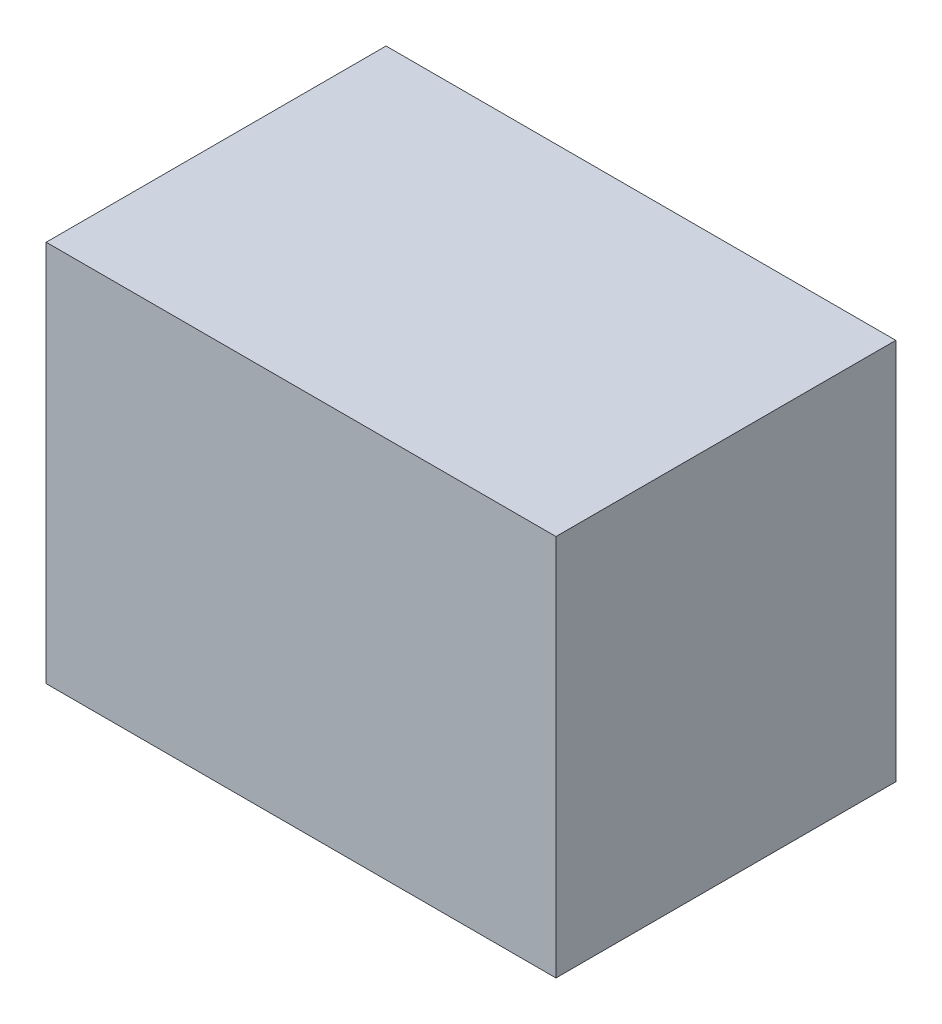
ISO-10303-21;
HEADER;
FILE_DESCRIPTION(('STEP AP214'),'2;1');
FILE_NAME('part.step','',(''),(''),'','','');
FILE_SCHEMA(('AUTOMOTIVE_DESIGN { 1 0 10303 214 1 1 1 1 }'));
ENDSEC;
DATA;
#1=APPLICATION_CONTEXT('core data for automotive mechanical design processes');
#2=APPLICATION_PROTOCOL_DEFINITION('international standard','automotive_design',2000,#1);
#3=PRODUCT_CONTEXT('',#1,'mechanical');
#4=PRODUCT('Part','Part','',(#3));
#5=PRODUCT_RELATED_PRODUCT_CATEGORY('part','',(#4));
#6=PRODUCT_DEFINITION_FORMATION('','',#4);
#7=PRODUCT_DEFINITION_CONTEXT('part definition',#1,'design');
#8=PRODUCT_DEFINITION('design','',#6,#7);
#9=PRODUCT_DEFINITION_SHAPE('','',#8);
#10=(LENGTH_UNIT() NAMED_UNIT(*) SI_UNIT(.MILLI.,.METRE.));
#11=(NAMED_UNIT(*) PLANE_ANGLE_UNIT() SI_UNIT($,.RADIAN.));
#12=(NAMED_UNIT(*) SI_UNIT($,.STERADIAN.) SOLID_ANGLE_UNIT());
#13=UNCERTAINTY_MEASURE_WITH_UNIT(LENGTH_MEASURE(1.E-05),#10,'distance_accuracy_value','');
#14=(GEOMETRIC_REPRESENTATION_CONTEXT(3) GLOBAL_UNCERTAINTY_ASSIGNED_CONTEXT((#13)) GLOBAL_UNIT_ASSIGNED_CONTEXT((#10,
#11,#12)) REPRESENTATION_CONTEXT('',''));
#15=CARTESIAN_POINT('',(0.,0.,0.));
#16=DIRECTION('',(0.,0.,1.));
#17=DIRECTION('',(1.,0.,0.));
#18=AXIS2_PLACEMENT_3D('',#15,#16,#17);
#19=CARTESIAN_POINT('',(30.,45.,-20.));
#20=DIRECTION('',(-1.,0.,0.));
#21=DIRECTION('',(0.,0.,1.));
#22=AXIS2_PLACEMENT_3D('',#19,#20,#21);
#23=PLANE('',#22);
#24=DIRECTION('',(0.,0.,-1.));
#25=VECTOR('',#24,1.);
#26=CARTESIAN_POINT('',(30.,0.,-20.));
#27=LINE('',#26,#25);
#28=CARTESIAN_POINT('',(30.,0.,20.));
#29=VERTEX_POINT('',#28);
#30=CARTESIAN_POINT('',(30.,0.,-20.));
#31=VERTEX_POINT('',#30);
#32=EDGE_CURVE('E104',#29,#31,#27,.T.);
#33=ORIENTED_EDGE('',*,*,#32,.T.);
#34=DIRECTION('',(0.,-1.,0.));
#35=VECTOR('',#34,1.);
#36=CARTESIAN_POINT('',(30.,45.,-20.));
#37=LINE('',#36,#35);
#38=CARTESIAN_POINT('',(30.,45.,-20.));
#39=VERTEX_POINT('',#38);
#40=EDGE_CURVE('E11',#39,#31,#37,.T.);
#41=ORIENTED_EDGE('',*,*,#40,.F.);
#42=DIRECTION('',(0.,0.,-1.));
#43=VECTOR('',#42,1.);
#44=CARTESIAN_POINT('',(30.,45.,-20.));
#45=LINE('',#44,#43);
#46=CARTESIAN_POINT('',(30.,45.,20.));
#47=VERTEX_POINT('',#46);
#48=EDGE_CURVE('E92',#47,#39,#45,.T.);
#49=ORIENTED_EDGE('',*,*,#48,.F.);
#50=DIRECTION('',(0.,-1.,0.));
#51=VECTOR('',#50,1.);
#52=CARTESIAN_POINT('',(30.,45.,20.));
#53=LINE('',#52,#51);
#54=EDGE_CURVE('E100',#47,#29,#53,.T.);
#55=ORIENTED_EDGE('',*,*,#54,.T.);
#56=EDGE_LOOP('',(#33,#41,#49,#55));
#57=FACE_BOUND('',#56,.T.);
#58=ADVANCED_FACE('F41',(#57),#23,.F.);
#59=CARTESIAN_POINT('',(-30.,45.,-20.));
#60=DIRECTION('',(0.,0.,1.));
#61=DIRECTION('',(1.,0.,0.));
#62=AXIS2_PLACEMENT_3D('',#59,#60,#61);
#63=PLANE('',#62);
#64=DIRECTION('',(-1.,0.,0.));
#65=VECTOR('',#64,1.);
#66=CARTESIAN_POINT('',(-30.,0.,-20.));
#67=LINE('',#66,#65);
#68=CARTESIAN_POINT('',(-30.,0.,-20.));
#69=VERTEX_POINT('',#68);
#70=EDGE_CURVE('E96',#31,#69,#67,.T.);
#71=ORIENTED_EDGE('',*,*,#70,.T.);
#72=DIRECTION('',(0.,-1.,0.));
#73=VECTOR('',#72,1.);
#74=CARTESIAN_POINT('',(-30.,45.,-20.));
#75=LINE('',#74,#73);
#76=CARTESIAN_POINT('',(-30.,45.,-20.));
#77=VERTEX_POINT('',#76);
#78=EDGE_CURVE('E49',#77,#69,#75,.T.);
#79=ORIENTED_EDGE('',*,*,#78,.F.);
#80=DIRECTION('',(-1.,0.,0.));
#81=VECTOR('',#80,1.);
#82=CARTESIAN_POINT('',(-30.,45.,-20.));
#83=LINE('',#82,#81);
#84=EDGE_CURVE('E87',#39,#77,#83,.T.);
#85=ORIENTED_EDGE('',*,*,#84,.F.);
#86=ORIENTED_EDGE('',*,*,#40,.T.);
#87=EDGE_LOOP('',(#71,#79,#85,#86));
#88=FACE_BOUND('',#87,.T.);
#89=ADVANCED_FACE('F95',(#88),#63,.F.);
#90=CARTESIAN_POINT('',(-30.,45.,-20.));
#91=DIRECTION('',(1.,0.,0.));
#92=DIRECTION('',(0.,0.,-1.));
#93=AXIS2_PLACEMENT_3D('',#90,#91,#92);
#94=PLANE('',#93);
#95=DIRECTION('',(0.,0.,1.));
#96=VECTOR('',#95,1.);
#97=CARTESIAN_POINT('',(-30.,0.,-20.));
#98=LINE('',#97,#96);
#99=CARTESIAN_POINT('',(-30.,0.,20.));
#100=VERTEX_POINT('',#99);
#101=EDGE_CURVE('E74',#69,#100,#98,.T.);
#102=ORIENTED_EDGE('',*,*,#101,.T.);
#103=DIRECTION('',(0.,-1.,0.));
#104=VECTOR('',#103,1.);
#105=CARTESIAN_POINT('',(-30.,45.,20.));
#106=LINE('',#105,#104);
#107=CARTESIAN_POINT('',(-30.,45.,20.));
#108=VERTEX_POINT('',#107);
#109=EDGE_CURVE('E97',#108,#100,#106,.T.);
#110=ORIENTED_EDGE('',*,*,#109,.F.);
#111=DIRECTION('',(0.,0.,1.));
#112=VECTOR('',#111,1.);
#113=CARTESIAN_POINT('',(-30.,45.,-20.));
#114=LINE('',#113,#112);
#115=EDGE_CURVE('E90',#77,#108,#114,.T.);
#116=ORIENTED_EDGE('',*,*,#115,.F.);
#117=ORIENTED_EDGE('',*,*,#78,.T.);
#118=EDGE_LOOP('',(#102,#110,#116,#117));
#119=FACE_BOUND('',#118,.T.);
#120=ADVANCED_FACE('F98',(#119),#94,.F.);
#121=CARTESIAN_POINT('',(-30.,45.,20.));
#122=DIRECTION('',(0.,0.,-1.));
#123=DIRECTION('',(-1.,0.,0.));
#124=AXIS2_PLACEMENT_3D('',#121,#122,#123);
#125=PLANE('',#124);
#126=DIRECTION('',(1.,0.,0.));
#127=VECTOR('',#126,1.);
#128=CARTESIAN_POINT('',(-30.,0.,20.));
#129=LINE('',#128,#127);
#130=EDGE_CURVE('E80',#100,#29,#129,.T.);
#131=ORIENTED_EDGE('',*,*,#130,.T.);
#132=ORIENTED_EDGE('',*,*,#54,.F.);
#133=DIRECTION('',(1.,0.,0.));
#134=VECTOR('',#133,1.);
#135=CARTESIAN_POINT('',(-30.,45.,20.));
#136=LINE('',#135,#134);
#137=EDGE_CURVE('E57',#108,#47,#136,.T.);
#138=ORIENTED_EDGE('',*,*,#137,.F.);
#139=ORIENTED_EDGE('',*,*,#109,.T.);
#140=EDGE_LOOP('',(#131,#132,#138,#139));
#141=FACE_BOUND('',#140,.T.);
#142=ADVANCED_FACE('F111',(#141),#125,.F.);
#143=CARTESIAN_POINT('',(0.,45.,0.));
#144=DIRECTION('',(0.,1.,0.));
#145=DIRECTION('',(0.,0.,1.));
#146=AXIS2_PLACEMENT_3D('',#143,#144,#145);
#147=PLANE('',#146);
#148=ORIENTED_EDGE('',*,*,#48,.T.);
#149=ORIENTED_EDGE('',*,*,#84,.T.);
#150=ORIENTED_EDGE('',*,*,#115,.T.);
#151=ORIENTED_EDGE('',*,*,#137,.T.);
#152=EDGE_LOOP('',(#148,#149,#150,#151));
#153=FACE_BOUND('',#152,.T.);
#154=ADVANCED_FACE('F88',(#153),#147,.T.);
#155=CARTESIAN_POINT('',(0.,0.,0.));
#156=DIRECTION('',(0.,1.,0.));
#157=DIRECTION('',(0.,0.,1.));
#158=AXIS2_PLACEMENT_3D('',#155,#156,#157);
#159=PLANE('',#158);
#160=ORIENTED_EDGE('',*,*,#32,.F.);
#161=ORIENTED_EDGE('',*,*,#130,.F.);
#162=ORIENTED_EDGE('',*,*,#101,.F.);
#163=ORIENTED_EDGE('',*,*,#70,.F.);
#164=EDGE_LOOP('',(#160,#161,#162,#163));
#165=FACE_BOUND('',#164,.T.);
#166=ADVANCED_FACE('F114',(#165),#159,.F.);
#167=CLOSED_SHELL('',(#58,#89,#120,#142,#154,#166));
#168=MANIFOLD_SOLID_BREP('B2',#167);
#169=ADVANCED_BREP_SHAPE_REPRESENTATION('',(#18,#168),#14);
#170=SHAPE_DEFINITION_REPRESENTATION(#9,#169);
ENDSEC;
END-ISO-10303-21;
